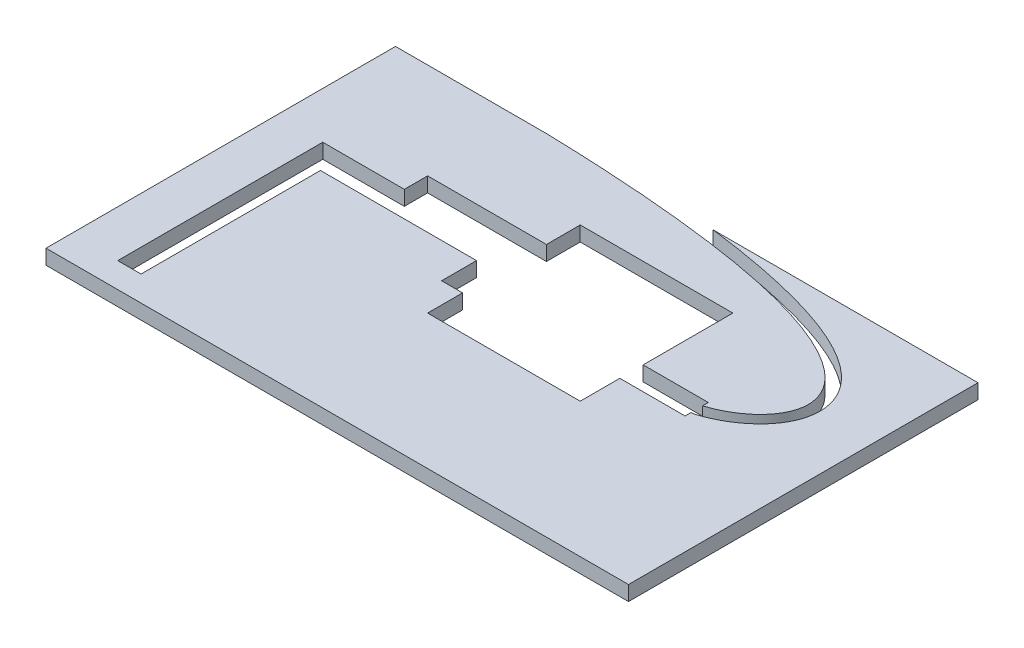
ISO-10303-21;
HEADER;
FILE_DESCRIPTION(('STEP AP214'),'2;1');
FILE_NAME('part.step','',(''),(''),'','','');
FILE_SCHEMA(('AUTOMOTIVE_DESIGN { 1 0 10303 214 1 1 1 1 }'));
ENDSEC;
DATA;
#1=APPLICATION_CONTEXT('core data for automotive mechanical design processes');
#2=APPLICATION_PROTOCOL_DEFINITION('international standard','automotive_design',2000,#1);
#3=PRODUCT_CONTEXT('',#1,'mechanical');
#4=PRODUCT('Part','Part','',(#3));
#5=PRODUCT_RELATED_PRODUCT_CATEGORY('part','',(#4));
#6=PRODUCT_DEFINITION_FORMATION('','',#4);
#7=PRODUCT_DEFINITION_CONTEXT('part definition',#1,'design');
#8=PRODUCT_DEFINITION('design','',#6,#7);
#9=PRODUCT_DEFINITION_SHAPE('','',#8);
#10=(LENGTH_UNIT() NAMED_UNIT(*) SI_UNIT(.MILLI.,.METRE.));
#11=(NAMED_UNIT(*) PLANE_ANGLE_UNIT() SI_UNIT($,.RADIAN.));
#12=(NAMED_UNIT(*) SI_UNIT($,.STERADIAN.) SOLID_ANGLE_UNIT());
#13=UNCERTAINTY_MEASURE_WITH_UNIT(LENGTH_MEASURE(1.E-05),#10,'distance_accuracy_value','');
#14=(GEOMETRIC_REPRESENTATION_CONTEXT(3) GLOBAL_UNCERTAINTY_ASSIGNED_CONTEXT((#13)) GLOBAL_UNIT_ASSIGNED_CONTEXT((#10,
#11,#12)) REPRESENTATION_CONTEXT('',''));
#15=CARTESIAN_POINT('',(0.,0.,0.));
#16=DIRECTION('',(0.,0.,1.));
#17=DIRECTION('',(1.,0.,0.));
#18=AXIS2_PLACEMENT_3D('',#15,#16,#17);
#19=CARTESIAN_POINT('',(11.34053228974,6.35,-75.));
#20=DIRECTION('',(0.,0.,1.));
#21=DIRECTION('',(1.,0.,0.));
#22=AXIS2_PLACEMENT_3D('',#19,#20,#21);
#23=PLANE('',#22);
#24=DIRECTION('',(-1.,0.,0.));
#25=VECTOR('',#24,1.);
#26=CARTESIAN_POINT('',(11.34053228974,0.,-75.));
#27=LINE('',#26,#25);
#28=CARTESIAN_POINT('',(125.,0.,-75.));
#29=VERTEX_POINT('',#28);
#30=CARTESIAN_POINT('',(11.3405326056849,0.,-75.0000024767574));
#31=VERTEX_POINT('',#30);
#32=EDGE_CURVE('E242',#29,#31,#27,.T.);
#33=ORIENTED_EDGE('',*,*,#32,.T.);
#34=DIRECTION('',(0.,-1.,0.));
#35=VECTOR('',#34,1.);
#36=CARTESIAN_POINT('',(11.3405326056849,6.35,-75.0000024767574));
#37=LINE('',#36,#35);
#38=CARTESIAN_POINT('',(11.3405326056849,6.35,-75.0000024767574));
#39=VERTEX_POINT('',#38);
#40=EDGE_CURVE('E11',#39,#31,#37,.T.);
#41=ORIENTED_EDGE('',*,*,#40,.F.);
#42=DIRECTION('',(-1.,0.,0.));
#43=VECTOR('',#42,1.);
#44=CARTESIAN_POINT('',(11.34053228974,6.35,-75.));
#45=LINE('',#44,#43);
#46=CARTESIAN_POINT('',(125.,6.35,-75.));
#47=VERTEX_POINT('',#46);
#48=EDGE_CURVE('E304',#47,#39,#45,.T.);
#49=ORIENTED_EDGE('',*,*,#48,.F.);
#50=DIRECTION('',(0.,-1.,0.));
#51=VECTOR('',#50,1.);
#52=CARTESIAN_POINT('',(125.,6.35,-75.));
#53=LINE('',#52,#51);
#54=EDGE_CURVE('E238',#47,#29,#53,.T.);
#55=ORIENTED_EDGE('',*,*,#54,.T.);
#56=EDGE_LOOP('',(#33,#41,#49,#55));
#57=FACE_BOUND('',#56,.T.);
#58=ADVANCED_FACE('F32',(#57),#23,.F.);
#59=CARTESIAN_POINT('',(-59.8676180191488,6.35,-79.9982471938817));
#60=CARTESIAN_POINT('',(-58.3701365612628,6.35,-79.9585853776501));
#61=CARTESIAN_POINT('',(-55.3563358386975,6.35,-79.8722181448976));
#62=CARTESIAN_POINT('',(-49.4815909142166,6.35,-79.6777111699217));
#63=CARTESIAN_POINT('',(-42.317738026553,6.35,-79.3915891409619));
#64=CARTESIAN_POINT('',(-34.0365193755814,6.35,-78.98234302079));
#65=CARTESIAN_POINT('',(-23.3969951315726,6.35,-78.3511650278801));
#66=CARTESIAN_POINT('',(-10.8443758688556,6.35,-77.4069664924747));
#67=CARTESIAN_POINT('',(3.06599334303034,6.35,-76.0412777275979));
#68=CARTESIAN_POINT('',(15.8637727031265,6.35,-74.4584722510144));
#69=CARTESIAN_POINT('',(31.4988229265428,6.35,-72.0787544208223));
#70=CARTESIAN_POINT('',(48.4668754676069,6.35,-68.6363462683328));
#71=CARTESIAN_POINT('',(65.0428990103915,6.35,-63.8669275282695));
#72=CARTESIAN_POINT('',(78.1767321943279,6.35,-58.5488488699207));
#73=CARTESIAN_POINT('',(88.2140590688272,6.35,-52.733240312104));
#74=CARTESIAN_POINT('',(95.4704601424928,6.35,-46.4059976378602));
#75=CARTESIAN_POINT('',(100.125264277799,6.35,-39.4914289547468));
#76=CARTESIAN_POINT('',(102.069690208737,6.35,-32.1108697625363));
#77=CARTESIAN_POINT('',(101.313529062244,6.35,-24.9425506592067));
#78=CARTESIAN_POINT('',(98.4533256841167,6.35,-18.5915794822402));
#79=CARTESIAN_POINT('',(94.1279275243369,6.35,-13.1582873344004));
#80=CARTESIAN_POINT('',(86.9558741819707,6.35,-7.10408049523904));
#81=CARTESIAN_POINT('',(80.4789458091353,6.35,-3.91902752008362));
#82=CARTESIAN_POINT('',(75.9958119832402,6.35,-2.51347108384346));
#83=B_SPLINE_CURVE_WITH_KNOTS('',3,(#59,#60,#61,#62,#63,#64,#65,#66,#67,#68,#69,#70,#71,#72,#73,
#74,#75,#76,#77,#78,#79,#80,#81,#82),.UNSPECIFIED.,.F.,.F.,(4,1,1,1,1,1,1,1,1,1,1,1,1,1,1,1,1,1,
1,1,1,4),(0.,0.0078125,0.015625,0.03125,0.046875,0.0625,0.09375,0.125,0.15625,0.1875,0.25,
0.3125,0.375,0.4375,0.5,0.5625,0.625,0.6875,0.75,0.8125,0.875,1.),.UNSPECIFIED.);
#84=DIRECTION('',(0.,-1.,0.));
#85=VECTOR('',#84,1.);
#86=SURFACE_OF_LINEAR_EXTRUSION('',#83,#85);
#87=CARTESIAN_POINT('',(-59.8676180191488,0.,-79.9982471938817));
#88=CARTESIAN_POINT('',(-58.3701365612628,0.,-79.9585853776501));
#89=CARTESIAN_POINT('',(-55.3563358386975,0.,-79.8722181448976));
#90=CARTESIAN_POINT('',(-49.4815909142166,0.,-79.6777111699217));
#91=CARTESIAN_POINT('',(-42.317738026553,0.,-79.3915891409619));
#92=CARTESIAN_POINT('',(-34.0365193755814,0.,-78.98234302079));
#93=CARTESIAN_POINT('',(-23.3969951315726,0.,-78.3511650278801));
#94=CARTESIAN_POINT('',(-10.8443758688556,0.,-77.4069664924747));
#95=CARTESIAN_POINT('',(3.06599334303034,0.,-76.0412777275979));
#96=CARTESIAN_POINT('',(15.8637727031265,0.,-74.4584722510144));
#97=CARTESIAN_POINT('',(31.4988229265428,0.,-72.0787544208223));
#98=CARTESIAN_POINT('',(48.4668754676069,0.,-68.6363462683328));
#99=CARTESIAN_POINT('',(65.0428990103915,0.,-63.8669275282695));
#100=CARTESIAN_POINT('',(78.1767321943279,0.,-58.5488488699207));
#101=CARTESIAN_POINT('',(88.2140590688272,0.,-52.733240312104));
#102=CARTESIAN_POINT('',(95.4704601424928,0.,-46.4059976378602));
#103=CARTESIAN_POINT('',(100.125264277799,0.,-39.4914289547468));
#104=CARTESIAN_POINT('',(102.069690208737,0.,-32.1108697625363));
#105=CARTESIAN_POINT('',(101.313529062244,0.,-24.9425506592067));
#106=CARTESIAN_POINT('',(98.4533256841167,0.,-18.5915794822402));
#107=CARTESIAN_POINT('',(94.1279275243369,0.,-13.1582873344004));
#108=CARTESIAN_POINT('',(86.9558741819707,0.,-7.10408049523904));
#109=CARTESIAN_POINT('',(80.4789458091353,0.,-3.91902752008362));
#110=CARTESIAN_POINT('',(75.9958119832402,0.,-2.51347108384346));
#111=B_SPLINE_CURVE_WITH_KNOTS('',3,(#87,#88,#89,#90,#91,#92,#93,#94,#95,#96,#97,#98,#99,#100,
#101,#102,#103,#104,#105,#106,#107,#108,#109,#110),.UNSPECIFIED.,.F.,.F.,(4,1,1,1,1,1,1,1,1,1,1,
1,1,1,1,1,1,1,1,1,1,4),(0.,0.0078125,0.015625,0.03125,0.046875,0.0625,0.09375,0.125,0.15625,
0.1875,0.25,0.3125,0.375,0.4375,0.5,0.5625,0.625,0.6875,0.75,0.8125,0.875,1.),.UNSPECIFIED.);
#112=CARTESIAN_POINT('',(75.9958119832402,0.,-2.51347108384346));
#113=VERTEX_POINT('',#112);
#114=EDGE_CURVE('E245',#31,#113,#111,.T.);
#115=ORIENTED_EDGE('',*,*,#114,.T.);
#116=DIRECTION('',(0.,-1.,0.));
#117=VECTOR('',#116,1.);
#118=CARTESIAN_POINT('',(75.9958119832402,6.35,-2.51347108384346));
#119=LINE('',#118,#117);
#120=CARTESIAN_POINT('',(75.9958119832402,6.35,-2.51347108384346));
#121=VERTEX_POINT('',#120);
#122=EDGE_CURVE('E40',#121,#113,#119,.T.);
#123=ORIENTED_EDGE('',*,*,#122,.F.);
#124=EDGE_CURVE('E148',#39,#121,#83,.T.);
#125=ORIENTED_EDGE('',*,*,#124,.F.);
#126=ORIENTED_EDGE('',*,*,#40,.T.);
#127=EDGE_LOOP('',(#115,#123,#125,#126));
#128=FACE_BOUND('',#127,.T.);
#129=ADVANCED_FACE('F520',(#128),#86,.F.);
#130=CARTESIAN_POINT('',(74.5,6.35,-2.28448214134428));
#131=DIRECTION('',(0.151323805959003,0.,0.988484246586703));
#132=DIRECTION('',(0.988484246586703,0.,-0.151323805959003));
#133=AXIS2_PLACEMENT_3D('',#130,#131,#132);
#134=PLANE('',#133);
#135=DIRECTION('',(-0.988484246586703,0.,0.151323805959003));
#136=VECTOR('',#135,1.);
#137=CARTESIAN_POINT('',(74.5,0.,-2.28448214134428));
#138=LINE('',#137,#136);
#139=CARTESIAN_POINT('',(74.5,0.,-2.28448214134428));
#140=VERTEX_POINT('',#139);
#141=EDGE_CURVE('E249',#113,#140,#138,.T.);
#142=ORIENTED_EDGE('',*,*,#141,.T.);
#143=DIRECTION('',(0.,-1.,0.));
#144=VECTOR('',#143,1.);
#145=CARTESIAN_POINT('',(74.5,6.35,-2.28448214134428));
#146=LINE('',#145,#144);
#147=CARTESIAN_POINT('',(74.5,6.35,-2.28448214134428));
#148=VERTEX_POINT('',#147);
#149=EDGE_CURVE('E368',#148,#140,#146,.T.);
#150=ORIENTED_EDGE('',*,*,#149,.F.);
#151=DIRECTION('',(-0.988484246586703,0.,0.151323805959003));
#152=VECTOR('',#151,1.);
#153=CARTESIAN_POINT('',(74.5,6.35,-2.28448214134428));
#154=LINE('',#153,#152);
#155=EDGE_CURVE('E376',#121,#148,#154,.T.);
#156=ORIENTED_EDGE('',*,*,#155,.F.);
#157=ORIENTED_EDGE('',*,*,#122,.T.);
#158=EDGE_LOOP('',(#142,#150,#156,#157));
#159=FACE_BOUND('',#158,.T.);
#160=ADVANCED_FACE('F374',(#159),#134,.F.);
#161=CARTESIAN_POINT('',(74.5,6.35,0.215517858655716));
#162=DIRECTION('',(1.,0.,0.));
#163=DIRECTION('',(0.,0.,-1.));
#164=AXIS2_PLACEMENT_3D('',#161,#162,#163);
#165=PLANE('',#164);
#166=DIRECTION('',(0.,0.,1.));
#167=VECTOR('',#166,1.);
#168=CARTESIAN_POINT('',(74.5,0.,0.215517858655716));
#169=LINE('',#168,#167);
#170=CARTESIAN_POINT('',(74.5,0.,0.215517858655716));
#171=VERTEX_POINT('',#170);
#172=EDGE_CURVE('E254',#140,#171,#169,.T.);
#173=ORIENTED_EDGE('',*,*,#172,.T.);
#174=DIRECTION('',(0.,-1.,0.));
#175=VECTOR('',#174,1.);
#176=CARTESIAN_POINT('',(74.5,6.35,0.215517858655716));
#177=LINE('',#176,#175);
#178=CARTESIAN_POINT('',(74.5,6.35,0.215517858655716));
#179=VERTEX_POINT('',#178);
#180=EDGE_CURVE('E365',#179,#171,#177,.T.);
#181=ORIENTED_EDGE('',*,*,#180,.F.);
#182=DIRECTION('',(0.,0.,1.));
#183=VECTOR('',#182,1.);
#184=CARTESIAN_POINT('',(74.5,6.35,0.215517858655716));
#185=LINE('',#184,#183);
#186=EDGE_CURVE('E394',#148,#179,#185,.T.);
#187=ORIENTED_EDGE('',*,*,#186,.F.);
#188=ORIENTED_EDGE('',*,*,#149,.T.);
#189=EDGE_LOOP('',(#173,#181,#187,#188));
#190=FACE_BOUND('',#189,.T.);
#191=ADVANCED_FACE('F385',(#190),#165,.F.);
#192=CARTESIAN_POINT('',(46.5,6.35,0.215517858655716));
#193=DIRECTION('',(0.,0.,1.));
#194=DIRECTION('',(1.,0.,0.));
#195=AXIS2_PLACEMENT_3D('',#192,#193,#194);
#196=PLANE('',#195);
#197=DIRECTION('',(-1.,0.,0.));
#198=VECTOR('',#197,1.);
#199=CARTESIAN_POINT('',(46.5,0.,0.215517858655716));
#200=LINE('',#199,#198);
#201=CARTESIAN_POINT('',(46.5,0.,0.215517858655716));
#202=VERTEX_POINT('',#201);
#203=EDGE_CURVE('E256',#171,#202,#200,.T.);
#204=ORIENTED_EDGE('',*,*,#203,.T.);
#205=DIRECTION('',(0.,-1.,0.));
#206=VECTOR('',#205,1.);
#207=CARTESIAN_POINT('',(46.5,6.35,0.215517858655716));
#208=LINE('',#207,#206);
#209=CARTESIAN_POINT('',(46.5,6.35,0.215517858655716));
#210=VERTEX_POINT('',#209);
#211=EDGE_CURVE('E362',#210,#202,#208,.T.);
#212=ORIENTED_EDGE('',*,*,#211,.F.);
#213=DIRECTION('',(-1.,0.,0.));
#214=VECTOR('',#213,1.);
#215=CARTESIAN_POINT('',(46.5,6.35,0.215517858655716));
#216=LINE('',#215,#214);
#217=EDGE_CURVE('E391',#179,#210,#216,.T.);
#218=ORIENTED_EDGE('',*,*,#217,.F.);
#219=ORIENTED_EDGE('',*,*,#180,.T.);
#220=EDGE_LOOP('',(#204,#212,#218,#219));
#221=FACE_BOUND('',#220,.T.);
#222=ADVANCED_FACE('F389',(#221),#196,.F.);
#223=CARTESIAN_POINT('',(46.5,6.35,17.2155178586557));
#224=DIRECTION('',(1.,0.,0.));
#225=DIRECTION('',(0.,0.,-1.));
#226=AXIS2_PLACEMENT_3D('',#223,#224,#225);
#227=PLANE('',#226);
#228=DIRECTION('',(0.,0.,1.));
#229=VECTOR('',#228,1.);
#230=CARTESIAN_POINT('',(46.5,0.,17.2155178586557));
#231=LINE('',#230,#229);
#232=CARTESIAN_POINT('',(46.5,0.,17.2155178586557));
#233=VERTEX_POINT('',#232);
#234=EDGE_CURVE('E258',#202,#233,#231,.T.);
#235=ORIENTED_EDGE('',*,*,#234,.T.);
#236=DIRECTION('',(0.,-1.,0.));
#237=VECTOR('',#236,1.);
#238=CARTESIAN_POINT('',(46.5,6.35,17.2155178586557));
#239=LINE('',#238,#237);
#240=CARTESIAN_POINT('',(46.5,6.35,17.2155178586557));
#241=VERTEX_POINT('',#240);
#242=EDGE_CURVE('E359',#241,#233,#239,.T.);
#243=ORIENTED_EDGE('',*,*,#242,.F.);
#244=DIRECTION('',(0.,0.,1.));
#245=VECTOR('',#244,1.);
#246=CARTESIAN_POINT('',(46.5,6.35,17.2155178586557));
#247=LINE('',#246,#245);
#248=EDGE_CURVE('E393',#210,#241,#247,.T.);
#249=ORIENTED_EDGE('',*,*,#248,.F.);
#250=ORIENTED_EDGE('',*,*,#211,.T.);
#251=EDGE_LOOP('',(#235,#243,#249,#250));
#252=FACE_BOUND('',#251,.T.);
#253=ADVANCED_FACE('F510',(#252),#227,.F.);
#254=CARTESIAN_POINT('',(-19.,6.35,17.2155178586557));
#255=DIRECTION('',(0.,0.,1.));
#256=DIRECTION('',(1.,0.,0.));
#257=AXIS2_PLACEMENT_3D('',#254,#255,#256);
#258=PLANE('',#257);
#259=DIRECTION('',(-1.,0.,0.));
#260=VECTOR('',#259,1.);
#261=CARTESIAN_POINT('',(-19.,0.,17.2155178586557));
#262=LINE('',#261,#260);
#263=CARTESIAN_POINT('',(-19.,0.,17.2155178586557));
#264=VERTEX_POINT('',#263);
#265=EDGE_CURVE('E260',#233,#264,#262,.T.);
#266=ORIENTED_EDGE('',*,*,#265,.T.);
#267=DIRECTION('',(0.,-1.,0.));
#268=VECTOR('',#267,1.);
#269=CARTESIAN_POINT('',(-19.,6.35,17.2155178586557));
#270=LINE('',#269,#268);
#271=CARTESIAN_POINT('',(-19.,6.35,17.2155178586557));
#272=VERTEX_POINT('',#271);
#273=EDGE_CURVE('E356',#272,#264,#270,.T.);
#274=ORIENTED_EDGE('',*,*,#273,.F.);
#275=DIRECTION('',(-1.,0.,0.));
#276=VECTOR('',#275,1.);
#277=CARTESIAN_POINT('',(-19.,6.35,17.2155178586557));
#278=LINE('',#277,#276);
#279=EDGE_CURVE('E396',#241,#272,#278,.T.);
#280=ORIENTED_EDGE('',*,*,#279,.F.);
#281=ORIENTED_EDGE('',*,*,#242,.T.);
#282=EDGE_LOOP('',(#266,#274,#280,#281));
#283=FACE_BOUND('',#282,.T.);
#284=ADVANCED_FACE('F506',(#283),#258,.F.);
#285=CARTESIAN_POINT('',(-19.,6.35,2.21551785865572));
#286=DIRECTION('',(-1.,0.,0.));
#287=DIRECTION('',(0.,0.,1.));
#288=AXIS2_PLACEMENT_3D('',#285,#286,#287);
#289=PLANE('',#288);
#290=DIRECTION('',(0.,0.,-1.));
#291=VECTOR('',#290,1.);
#292=CARTESIAN_POINT('',(-19.,0.,2.21551785865572));
#293=LINE('',#292,#291);
#294=CARTESIAN_POINT('',(-19.,0.,2.21551785865572));
#295=VERTEX_POINT('',#294);
#296=EDGE_CURVE('E262',#264,#295,#293,.T.);
#297=ORIENTED_EDGE('',*,*,#296,.T.);
#298=DIRECTION('',(0.,-1.,0.));
#299=VECTOR('',#298,1.);
#300=CARTESIAN_POINT('',(-19.,6.35,2.21551785865572));
#301=LINE('',#300,#299);
#302=CARTESIAN_POINT('',(-19.,6.35,2.21551785865572));
#303=VERTEX_POINT('',#302);
#304=EDGE_CURVE('E353',#303,#295,#301,.T.);
#305=ORIENTED_EDGE('',*,*,#304,.F.);
#306=DIRECTION('',(0.,0.,-1.));
#307=VECTOR('',#306,1.);
#308=CARTESIAN_POINT('',(-19.,6.35,2.21551785865572));
#309=LINE('',#308,#307);
#310=EDGE_CURVE('E402',#272,#303,#309,.T.);
#311=ORIENTED_EDGE('',*,*,#310,.F.);
#312=ORIENTED_EDGE('',*,*,#273,.T.);
#313=EDGE_LOOP('',(#297,#305,#311,#312));
#314=FACE_BOUND('',#313,.T.);
#315=ADVANCED_FACE('F502',(#314),#289,.F.);
#316=CARTESIAN_POINT('',(-28.,6.35,2.21551785865572));
#317=DIRECTION('',(0.,0.,1.));
#318=DIRECTION('',(1.,0.,0.));
#319=AXIS2_PLACEMENT_3D('',#316,#317,#318);
#320=PLANE('',#319);
#321=DIRECTION('',(-1.,0.,0.));
#322=VECTOR('',#321,1.);
#323=CARTESIAN_POINT('',(-28.,0.,2.21551785865572));
#324=LINE('',#323,#322);
#325=CARTESIAN_POINT('',(-28.,0.,2.21551785865572));
#326=VERTEX_POINT('',#325);
#327=EDGE_CURVE('E264',#295,#326,#324,.T.);
#328=ORIENTED_EDGE('',*,*,#327,.T.);
#329=DIRECTION('',(0.,-1.,0.));
#330=VECTOR('',#329,1.);
#331=CARTESIAN_POINT('',(-28.,6.35,2.21551785865572));
#332=LINE('',#331,#330);
#333=CARTESIAN_POINT('',(-28.,6.35,2.21551785865572));
#334=VERTEX_POINT('',#333);
#335=EDGE_CURVE('E350',#334,#326,#332,.T.);
#336=ORIENTED_EDGE('',*,*,#335,.F.);
#337=DIRECTION('',(-1.,0.,0.));
#338=VECTOR('',#337,1.);
#339=CARTESIAN_POINT('',(-28.,6.35,2.21551785865572));
#340=LINE('',#339,#338);
#341=EDGE_CURVE('E404',#303,#334,#340,.T.);
#342=ORIENTED_EDGE('',*,*,#341,.F.);
#343=ORIENTED_EDGE('',*,*,#304,.T.);
#344=EDGE_LOOP('',(#328,#336,#342,#343));
#345=FACE_BOUND('',#344,.T.);
#346=ADVANCED_FACE('F498',(#345),#320,.F.);
#347=CARTESIAN_POINT('',(-28.,6.35,-12.7844821413443));
#348=DIRECTION('',(-1.,0.,0.));
#349=DIRECTION('',(0.,0.,1.));
#350=AXIS2_PLACEMENT_3D('',#347,#348,#349);
#351=PLANE('',#350);
#352=DIRECTION('',(0.,0.,-1.));
#353=VECTOR('',#352,1.);
#354=CARTESIAN_POINT('',(-28.,0.,-12.7844821413443));
#355=LINE('',#354,#353);
#356=CARTESIAN_POINT('',(-28.,0.,-12.7844821413443));
#357=VERTEX_POINT('',#356);
#358=EDGE_CURVE('E266',#326,#357,#355,.T.);
#359=ORIENTED_EDGE('',*,*,#358,.T.);
#360=DIRECTION('',(0.,-1.,0.));
#361=VECTOR('',#360,1.);
#362=CARTESIAN_POINT('',(-28.,6.35,-12.7844821413443));
#363=LINE('',#362,#361);
#364=CARTESIAN_POINT('',(-28.,6.35,-12.7844821413443));
#365=VERTEX_POINT('',#364);
#366=EDGE_CURVE('E347',#365,#357,#363,.T.);
#367=ORIENTED_EDGE('',*,*,#366,.F.);
#368=DIRECTION('',(0.,0.,-1.));
#369=VECTOR('',#368,1.);
#370=CARTESIAN_POINT('',(-28.,6.35,-12.7844821413443));
#371=LINE('',#370,#369);
#372=EDGE_CURVE('E406',#334,#365,#371,.T.);
#373=ORIENTED_EDGE('',*,*,#372,.F.);
#374=ORIENTED_EDGE('',*,*,#335,.T.);
#375=EDGE_LOOP('',(#359,#367,#373,#374));
#376=FACE_BOUND('',#375,.T.);
#377=ADVANCED_FACE('F494',(#376),#351,.F.);
#378=CARTESIAN_POINT('',(-95.,6.35,-12.7844821413443));
#379=DIRECTION('',(0.,0.,1.));
#380=DIRECTION('',(1.,0.,0.));
#381=AXIS2_PLACEMENT_3D('',#378,#379,#380);
#382=PLANE('',#381);
#383=DIRECTION('',(-1.,0.,0.));
#384=VECTOR('',#383,1.);
#385=CARTESIAN_POINT('',(-95.,0.,-12.7844821413443));
#386=LINE('',#385,#384);
#387=CARTESIAN_POINT('',(-95.,0.,-12.7844821413443));
#388=VERTEX_POINT('',#387);
#389=EDGE_CURVE('E268',#357,#388,#386,.T.);
#390=ORIENTED_EDGE('',*,*,#389,.T.);
#391=DIRECTION('',(0.,-1.,0.));
#392=VECTOR('',#391,1.);
#393=CARTESIAN_POINT('',(-95.,6.35,-12.7844821413443));
#394=LINE('',#393,#392);
#395=CARTESIAN_POINT('',(-95.,6.35,-12.7844821413443));
#396=VERTEX_POINT('',#395);
#397=EDGE_CURVE('E344',#396,#388,#394,.T.);
#398=ORIENTED_EDGE('',*,*,#397,.F.);
#399=DIRECTION('',(-1.,0.,0.));
#400=VECTOR('',#399,1.);
#401=CARTESIAN_POINT('',(-95.,6.35,-12.7844821413443));
#402=LINE('',#401,#400);
#403=EDGE_CURVE('E408',#365,#396,#402,.T.);
#404=ORIENTED_EDGE('',*,*,#403,.F.);
#405=ORIENTED_EDGE('',*,*,#366,.T.);
#406=EDGE_LOOP('',(#390,#398,#404,#405));
#407=FACE_BOUND('',#406,.T.);
#408=ADVANCED_FACE('F490',(#407),#382,.F.);
#409=CARTESIAN_POINT('',(-95.,6.35,64.2155178586557));
#410=DIRECTION('',(1.,0.,0.));
#411=DIRECTION('',(0.,0.,-1.));
#412=AXIS2_PLACEMENT_3D('',#409,#410,#411);
#413=PLANE('',#412);
#414=DIRECTION('',(0.,0.,1.));
#415=VECTOR('',#414,1.);
#416=CARTESIAN_POINT('',(-95.,0.,64.2155178586557));
#417=LINE('',#416,#415);
#418=CARTESIAN_POINT('',(-95.,0.,64.2155178586557));
#419=VERTEX_POINT('',#418);
#420=EDGE_CURVE('E270',#388,#419,#417,.T.);
#421=ORIENTED_EDGE('',*,*,#420,.T.);
#422=DIRECTION('',(0.,-1.,0.));
#423=VECTOR('',#422,1.);
#424=CARTESIAN_POINT('',(-95.,6.35,64.2155178586557));
#425=LINE('',#424,#423);
#426=CARTESIAN_POINT('',(-95.,6.35,64.2155178586557));
#427=VERTEX_POINT('',#426);
#428=EDGE_CURVE('E341',#427,#419,#425,.T.);
#429=ORIENTED_EDGE('',*,*,#428,.F.);
#430=DIRECTION('',(0.,0.,1.));
#431=VECTOR('',#430,1.);
#432=CARTESIAN_POINT('',(-95.,6.35,64.2155178586557));
#433=LINE('',#432,#431);
#434=EDGE_CURVE('E410',#396,#427,#433,.T.);
#435=ORIENTED_EDGE('',*,*,#434,.F.);
#436=ORIENTED_EDGE('',*,*,#397,.T.);
#437=EDGE_LOOP('',(#421,#429,#435,#436));
#438=FACE_BOUND('',#437,.T.);
#439=ADVANCED_FACE('F486',(#438),#413,.F.);
#440=CARTESIAN_POINT('',(-105.,6.35,64.2155178586557));
#441=DIRECTION('',(0.,0.,1.));
#442=DIRECTION('',(1.,0.,0.));
#443=AXIS2_PLACEMENT_3D('',#440,#441,#442);
#444=PLANE('',#443);
#445=DIRECTION('',(-1.,0.,0.));
#446=VECTOR('',#445,1.);
#447=CARTESIAN_POINT('',(-105.,0.,64.2155178586557));
#448=LINE('',#447,#446);
#449=CARTESIAN_POINT('',(-105.,0.,64.2155178586557));
#450=VERTEX_POINT('',#449);
#451=EDGE_CURVE('E272',#419,#450,#448,.T.);
#452=ORIENTED_EDGE('',*,*,#451,.T.);
#453=DIRECTION('',(0.,-1.,0.));
#454=VECTOR('',#453,1.);
#455=CARTESIAN_POINT('',(-105.,6.35,64.2155178586557));
#456=LINE('',#455,#454);
#457=CARTESIAN_POINT('',(-105.,6.35,64.2155178586557));
#458=VERTEX_POINT('',#457);
#459=EDGE_CURVE('E338',#458,#450,#456,.T.);
#460=ORIENTED_EDGE('',*,*,#459,.F.);
#461=DIRECTION('',(-1.,0.,0.));
#462=VECTOR('',#461,1.);
#463=CARTESIAN_POINT('',(-105.,6.35,64.2155178586557));
#464=LINE('',#463,#462);
#465=EDGE_CURVE('E412',#427,#458,#464,.T.);
#466=ORIENTED_EDGE('',*,*,#465,.F.);
#467=ORIENTED_EDGE('',*,*,#428,.T.);
#468=EDGE_LOOP('',(#452,#460,#466,#467));
#469=FACE_BOUND('',#468,.T.);
#470=ADVANCED_FACE('F482',(#469),#444,.F.);
#471=CARTESIAN_POINT('',(-105.,6.35,-23.7844821413443));
#472=DIRECTION('',(-1.,0.,0.));
#473=DIRECTION('',(0.,0.,1.));
#474=AXIS2_PLACEMENT_3D('',#471,#472,#473);
#475=PLANE('',#474);
#476=DIRECTION('',(0.,0.,-1.));
#477=VECTOR('',#476,1.);
#478=CARTESIAN_POINT('',(-105.,0.,-23.7844821413443));
#479=LINE('',#478,#477);
#480=CARTESIAN_POINT('',(-105.,0.,-23.7844821413443));
#481=VERTEX_POINT('',#480);
#482=EDGE_CURVE('E274',#450,#481,#479,.T.);
#483=ORIENTED_EDGE('',*,*,#482,.T.);
#484=DIRECTION('',(0.,-1.,0.));
#485=VECTOR('',#484,1.);
#486=CARTESIAN_POINT('',(-105.,6.35,-23.7844821413443));
#487=LINE('',#486,#485);
#488=CARTESIAN_POINT('',(-105.,6.35,-23.7844821413443));
#489=VERTEX_POINT('',#488);
#490=EDGE_CURVE('E335',#489,#481,#487,.T.);
#491=ORIENTED_EDGE('',*,*,#490,.F.);
#492=DIRECTION('',(0.,0.,-1.));
#493=VECTOR('',#492,1.);
#494=CARTESIAN_POINT('',(-105.,6.35,-23.7844821413443));
#495=LINE('',#494,#493);
#496=EDGE_CURVE('E414',#458,#489,#495,.T.);
#497=ORIENTED_EDGE('',*,*,#496,.F.);
#498=ORIENTED_EDGE('',*,*,#459,.T.);
#499=EDGE_LOOP('',(#483,#491,#497,#498));
#500=FACE_BOUND('',#499,.T.);
#501=ADVANCED_FACE('F478',(#500),#475,.F.);
#502=CARTESIAN_POINT('',(-70.,6.35,-23.7844821413443));
#503=DIRECTION('',(0.,0.,-1.));
#504=DIRECTION('',(-1.,0.,0.));
#505=AXIS2_PLACEMENT_3D('',#502,#503,#504);
#506=PLANE('',#505);
#507=DIRECTION('',(1.,0.,0.));
#508=VECTOR('',#507,1.);
#509=CARTESIAN_POINT('',(-70.,0.,-23.7844821413443));
#510=LINE('',#509,#508);
#511=CARTESIAN_POINT('',(-70.,0.,-23.7844821413443));
#512=VERTEX_POINT('',#511);
#513=EDGE_CURVE('E276',#481,#512,#510,.T.);
#514=ORIENTED_EDGE('',*,*,#513,.T.);
#515=DIRECTION('',(0.,-1.,0.));
#516=VECTOR('',#515,1.);
#517=CARTESIAN_POINT('',(-70.,6.35,-23.7844821413443));
#518=LINE('',#517,#516);
#519=CARTESIAN_POINT('',(-70.,6.35,-23.7844821413443));
#520=VERTEX_POINT('',#519);
#521=EDGE_CURVE('E332',#520,#512,#518,.T.);
#522=ORIENTED_EDGE('',*,*,#521,.F.);
#523=DIRECTION('',(1.,0.,0.));
#524=VECTOR('',#523,1.);
#525=CARTESIAN_POINT('',(-70.,6.35,-23.7844821413443));
#526=LINE('',#525,#524);
#527=EDGE_CURVE('E416',#489,#520,#526,.T.);
#528=ORIENTED_EDGE('',*,*,#527,.F.);
#529=ORIENTED_EDGE('',*,*,#490,.T.);
#530=EDGE_LOOP('',(#514,#522,#528,#529));
#531=FACE_BOUND('',#530,.T.);
#532=ADVANCED_FACE('F474',(#531),#506,.F.);
#533=CARTESIAN_POINT('',(-70.,6.35,-33.7844821413443));
#534=DIRECTION('',(-1.,0.,0.));
#535=DIRECTION('',(0.,0.,1.));
#536=AXIS2_PLACEMENT_3D('',#533,#534,#535);
#537=PLANE('',#536);
#538=DIRECTION('',(0.,0.,-1.));
#539=VECTOR('',#538,1.);
#540=CARTESIAN_POINT('',(-70.,0.,-33.7844821413443));
#541=LINE('',#540,#539);
#542=CARTESIAN_POINT('',(-70.,0.,-33.7844821413443));
#543=VERTEX_POINT('',#542);
#544=EDGE_CURVE('E278',#512,#543,#541,.T.);
#545=ORIENTED_EDGE('',*,*,#544,.T.);
#546=DIRECTION('',(0.,-1.,0.));
#547=VECTOR('',#546,1.);
#548=CARTESIAN_POINT('',(-70.,6.35,-33.7844821413443));
#549=LINE('',#548,#547);
#550=CARTESIAN_POINT('',(-70.,6.35,-33.7844821413443));
#551=VERTEX_POINT('',#550);
#552=EDGE_CURVE('E329',#551,#543,#549,.T.);
#553=ORIENTED_EDGE('',*,*,#552,.F.);
#554=DIRECTION('',(0.,0.,-1.));
#555=VECTOR('',#554,1.);
#556=CARTESIAN_POINT('',(-70.,6.35,-33.7844821413443));
#557=LINE('',#556,#555);
#558=EDGE_CURVE('E418',#520,#551,#557,.T.);
#559=ORIENTED_EDGE('',*,*,#558,.F.);
#560=ORIENTED_EDGE('',*,*,#521,.T.);
#561=EDGE_LOOP('',(#545,#553,#559,#560));
#562=FACE_BOUND('',#561,.T.);
#563=ADVANCED_FACE('F470',(#562),#537,.F.);
#564=CARTESIAN_POINT('',(-19.,6.35,-33.7844821413443));
#565=DIRECTION('',(0.,0.,-1.));
#566=DIRECTION('',(-1.,0.,0.));
#567=AXIS2_PLACEMENT_3D('',#564,#565,#566);
#568=PLANE('',#567);
#569=DIRECTION('',(1.,0.,0.));
#570=VECTOR('',#569,1.);
#571=CARTESIAN_POINT('',(-19.,0.,-33.7844821413443));
#572=LINE('',#571,#570);
#573=CARTESIAN_POINT('',(-19.,0.,-33.7844821413443));
#574=VERTEX_POINT('',#573);
#575=EDGE_CURVE('E280',#543,#574,#572,.T.);
#576=ORIENTED_EDGE('',*,*,#575,.T.);
#577=DIRECTION('',(0.,-1.,0.));
#578=VECTOR('',#577,1.);
#579=CARTESIAN_POINT('',(-19.,6.35,-33.7844821413443));
#580=LINE('',#579,#578);
#581=CARTESIAN_POINT('',(-19.,6.35,-33.7844821413443));
#582=VERTEX_POINT('',#581);
#583=EDGE_CURVE('E326',#582,#574,#580,.T.);
#584=ORIENTED_EDGE('',*,*,#583,.F.);
#585=DIRECTION('',(1.,0.,0.));
#586=VECTOR('',#585,1.);
#587=CARTESIAN_POINT('',(-19.,6.35,-33.7844821413443));
#588=LINE('',#587,#586);
#589=EDGE_CURVE('E420',#551,#582,#588,.T.);
#590=ORIENTED_EDGE('',*,*,#589,.F.);
#591=ORIENTED_EDGE('',*,*,#552,.T.);
#592=EDGE_LOOP('',(#576,#584,#590,#591));
#593=FACE_BOUND('',#592,.T.);
#594=ADVANCED_FACE('F466',(#593),#568,.F.);
#595=CARTESIAN_POINT('',(-19.,6.35,-48.2844821413443));
#596=DIRECTION('',(-1.,0.,0.));
#597=DIRECTION('',(0.,0.,1.));
#598=AXIS2_PLACEMENT_3D('',#595,#596,#597);
#599=PLANE('',#598);
#600=DIRECTION('',(0.,0.,-1.));
#601=VECTOR('',#600,1.);
#602=CARTESIAN_POINT('',(-19.,0.,-48.2844821413443));
#603=LINE('',#602,#601);
#604=CARTESIAN_POINT('',(-19.,0.,-48.2844821413443));
#605=VERTEX_POINT('',#604);
#606=EDGE_CURVE('E282',#574,#605,#603,.T.);
#607=ORIENTED_EDGE('',*,*,#606,.T.);
#608=DIRECTION('',(0.,-1.,0.));
#609=VECTOR('',#608,1.);
#610=CARTESIAN_POINT('',(-19.,6.35,-48.2844821413443));
#611=LINE('',#610,#609);
#612=CARTESIAN_POINT('',(-19.,6.35,-48.2844821413443));
#613=VERTEX_POINT('',#612);
#614=EDGE_CURVE('E323',#613,#605,#611,.T.);
#615=ORIENTED_EDGE('',*,*,#614,.F.);
#616=DIRECTION('',(0.,0.,-1.));
#617=VECTOR('',#616,1.);
#618=CARTESIAN_POINT('',(-19.,6.35,-48.2844821413443));
#619=LINE('',#618,#617);
#620=EDGE_CURVE('E422',#582,#613,#619,.T.);
#621=ORIENTED_EDGE('',*,*,#620,.F.);
#622=ORIENTED_EDGE('',*,*,#583,.T.);
#623=EDGE_LOOP('',(#607,#615,#621,#622));
#624=FACE_BOUND('',#623,.T.);
#625=ADVANCED_FACE('F462',(#624),#599,.F.);
#626=CARTESIAN_POINT('',(46.5,6.35,-48.2844821413443));
#627=DIRECTION('',(0.,0.,-1.));
#628=DIRECTION('',(-1.,0.,0.));
#629=AXIS2_PLACEMENT_3D('',#626,#627,#628);
#630=PLANE('',#629);
#631=DIRECTION('',(1.,0.,0.));
#632=VECTOR('',#631,1.);
#633=CARTESIAN_POINT('',(46.5,0.,-48.2844821413443));
#634=LINE('',#633,#632);
#635=CARTESIAN_POINT('',(46.5,0.,-48.2844821413443));
#636=VERTEX_POINT('',#635);
#637=EDGE_CURVE('E284',#605,#636,#634,.T.);
#638=ORIENTED_EDGE('',*,*,#637,.T.);
#639=DIRECTION('',(0.,-1.,0.));
#640=VECTOR('',#639,1.);
#641=CARTESIAN_POINT('',(46.5,6.35,-48.2844821413443));
#642=LINE('',#641,#640);
#643=CARTESIAN_POINT('',(46.5,6.35,-48.2844821413443));
#644=VERTEX_POINT('',#643);
#645=EDGE_CURVE('E320',#644,#636,#642,.T.);
#646=ORIENTED_EDGE('',*,*,#645,.F.);
#647=DIRECTION('',(1.,0.,0.));
#648=VECTOR('',#647,1.);
#649=CARTESIAN_POINT('',(46.5,6.35,-48.2844821413443));
#650=LINE('',#649,#648);
#651=EDGE_CURVE('E424',#613,#644,#650,.T.);
#652=ORIENTED_EDGE('',*,*,#651,.F.);
#653=ORIENTED_EDGE('',*,*,#614,.T.);
#654=EDGE_LOOP('',(#638,#646,#652,#653));
#655=FACE_BOUND('',#654,.T.);
#656=ADVANCED_FACE('F458',(#655),#630,.F.);
#657=CARTESIAN_POINT('',(46.5,6.35,-9.78448214134429));
#658=DIRECTION('',(1.,0.,0.));
#659=DIRECTION('',(0.,0.,-1.));
#660=AXIS2_PLACEMENT_3D('',#657,#658,#659);
#661=PLANE('',#660);
#662=DIRECTION('',(0.,0.,1.));
#663=VECTOR('',#662,1.);
#664=CARTESIAN_POINT('',(46.5,0.,-9.78448214134429));
#665=LINE('',#664,#663);
#666=CARTESIAN_POINT('',(46.5,0.,-9.78448214134429));
#667=VERTEX_POINT('',#666);
#668=EDGE_CURVE('E286',#636,#667,#665,.T.);
#669=ORIENTED_EDGE('',*,*,#668,.T.);
#670=DIRECTION('',(0.,-1.,0.));
#671=VECTOR('',#670,1.);
#672=CARTESIAN_POINT('',(46.5,6.35,-9.78448214134429));
#673=LINE('',#672,#671);
#674=CARTESIAN_POINT('',(46.5,6.35,-9.78448214134429));
#675=VERTEX_POINT('',#674);
#676=EDGE_CURVE('E317',#675,#667,#673,.T.);
#677=ORIENTED_EDGE('',*,*,#676,.F.);
#678=DIRECTION('',(0.,0.,1.));
#679=VECTOR('',#678,1.);
#680=CARTESIAN_POINT('',(46.5,6.35,-9.78448214134429));
#681=LINE('',#680,#679);
#682=EDGE_CURVE('E426',#644,#675,#681,.T.);
#683=ORIENTED_EDGE('',*,*,#682,.F.);
#684=ORIENTED_EDGE('',*,*,#645,.T.);
#685=EDGE_LOOP('',(#669,#677,#683,#684));
#686=FACE_BOUND('',#685,.T.);
#687=ADVANCED_FACE('F454',(#686),#661,.F.);
#688=CARTESIAN_POINT('',(74.5,6.35,-9.78448214134428));
#689=DIRECTION('',(0.,0.,-1.));
#690=DIRECTION('',(-1.,0.,0.));
#691=AXIS2_PLACEMENT_3D('',#688,#689,#690);
#692=PLANE('',#691);
#693=DIRECTION('',(1.,0.,0.));
#694=VECTOR('',#693,1.);
#695=CARTESIAN_POINT('',(74.5,0.,-9.78448214134428));
#696=LINE('',#695,#694);
#697=CARTESIAN_POINT('',(74.5,0.,-9.78448214134428));
#698=VERTEX_POINT('',#697);
#699=EDGE_CURVE('E288',#667,#698,#696,.T.);
#700=ORIENTED_EDGE('',*,*,#699,.T.);
#701=DIRECTION('',(0.,-1.,0.));
#702=VECTOR('',#701,1.);
#703=CARTESIAN_POINT('',(74.5,6.35,-9.78448214134428));
#704=LINE('',#703,#702);
#705=CARTESIAN_POINT('',(74.5,6.35,-9.78448214134428));
#706=VERTEX_POINT('',#705);
#707=EDGE_CURVE('E314',#706,#698,#704,.T.);
#708=ORIENTED_EDGE('',*,*,#707,.F.);
#709=DIRECTION('',(1.,0.,0.));
#710=VECTOR('',#709,1.);
#711=CARTESIAN_POINT('',(74.5,6.35,-9.78448214134428));
#712=LINE('',#711,#710);
#713=EDGE_CURVE('E428',#675,#706,#712,.T.);
#714=ORIENTED_EDGE('',*,*,#713,.F.);
#715=ORIENTED_EDGE('',*,*,#676,.T.);
#716=EDGE_LOOP('',(#700,#708,#714,#715));
#717=FACE_BOUND('',#716,.T.);
#718=ADVANCED_FACE('F450',(#717),#692,.F.);
#719=CARTESIAN_POINT('',(74.5,6.35,-7.28448214134429));
#720=DIRECTION('',(1.,0.,0.));
#721=DIRECTION('',(0.,0.,-1.));
#722=AXIS2_PLACEMENT_3D('',#719,#720,#721);
#723=PLANE('',#722);
#724=DIRECTION('',(0.,0.,1.));
#725=VECTOR('',#724,1.);
#726=CARTESIAN_POINT('',(74.5,0.,-7.28448214134429));
#727=LINE('',#726,#725);
#728=CARTESIAN_POINT('',(74.5,0.,-7.28448214134429));
#729=VERTEX_POINT('',#728);
#730=EDGE_CURVE('E290',#698,#729,#727,.T.);
#731=ORIENTED_EDGE('',*,*,#730,.T.);
#732=DIRECTION('',(0.,-1.,0.));
#733=VECTOR('',#732,1.);
#734=CARTESIAN_POINT('',(74.5,6.35,-7.28448214134429));
#735=LINE('',#734,#733);
#736=CARTESIAN_POINT('',(74.5,6.35,-7.28448214134429));
#737=VERTEX_POINT('',#736);
#738=EDGE_CURVE('E311',#737,#729,#735,.T.);
#739=ORIENTED_EDGE('',*,*,#738,.F.);
#740=DIRECTION('',(0.,0.,1.));
#741=VECTOR('',#740,1.);
#742=CARTESIAN_POINT('',(74.5,6.35,-7.28448214134429));
#743=LINE('',#742,#741);
#744=EDGE_CURVE('E430',#706,#737,#743,.T.);
#745=ORIENTED_EDGE('',*,*,#744,.F.);
#746=ORIENTED_EDGE('',*,*,#707,.T.);
#747=EDGE_LOOP('',(#731,#739,#745,#746));
#748=FACE_BOUND('',#747,.T.);
#749=ADVANCED_FACE('F445',(#748),#723,.F.);
#750=CARTESIAN_POINT('',(74.5,6.35,-7.28448214134429));
#751=CARTESIAN_POINT('',(106.249859101855,6.35,-17.2387285554406));
#752=CARTESIAN_POINT('',(132.436668924949,6.35,-69.9031837697084));
#753=CARTESIAN_POINT('',(-60.0000000000005,6.35,-75.));
#754=B_SPLINE_CURVE_WITH_KNOTS('',3,(#750,#751,#752,#753),.UNSPECIFIED.,.F.,.F.,(4,4),(0.,1.),.UNSPECIFIED.);
#755=DIRECTION('',(0.,-1.,0.));
#756=VECTOR('',#755,1.);
#757=SURFACE_OF_LINEAR_EXTRUSION('',#754,#756);
#758=CARTESIAN_POINT('',(74.5,0.,-7.28448214134429));
#759=CARTESIAN_POINT('',(106.249859101855,0.,-17.2387285554406));
#760=CARTESIAN_POINT('',(132.436668924949,0.,-69.9031837697084));
#761=CARTESIAN_POINT('',(-60.0000000000005,0.,-75.));
#762=B_SPLINE_CURVE_WITH_KNOTS('',3,(#758,#759,#760,#761),.UNSPECIFIED.,.F.,.F.,(4,4),(0.,1.),.UNSPECIFIED.);
#763=CARTESIAN_POINT('',(-60.,0.,-75.));
#764=VERTEX_POINT('',#763);
#765=EDGE_CURVE('E292',#729,#764,#762,.T.);
#766=ORIENTED_EDGE('',*,*,#765,.T.);
#767=DIRECTION('',(0.,-1.,0.));
#768=VECTOR('',#767,1.);
#769=CARTESIAN_POINT('',(-60.,6.35,-75.));
#770=LINE('',#769,#768);
#771=CARTESIAN_POINT('',(-60.,6.35,-75.));
#772=VERTEX_POINT('',#771);
#773=EDGE_CURVE('E308',#772,#764,#770,.T.);
#774=ORIENTED_EDGE('',*,*,#773,.F.);
#775=EDGE_CURVE('E432',#737,#772,#754,.T.);
#776=ORIENTED_EDGE('',*,*,#775,.F.);
#777=ORIENTED_EDGE('',*,*,#738,.T.);
#778=EDGE_LOOP('',(#766,#774,#776,#777));
#779=FACE_BOUND('',#778,.T.);
#780=ADVANCED_FACE('F440',(#779),#757,.F.);
#781=CARTESIAN_POINT('',(-125.,6.35,-75.));
#782=DIRECTION('',(0.,0.,1.));
#783=DIRECTION('',(1.,0.,0.));
#784=AXIS2_PLACEMENT_3D('',#781,#782,#783);
#785=PLANE('',#784);
#786=DIRECTION('',(-1.,0.,0.));
#787=VECTOR('',#786,1.);
#788=CARTESIAN_POINT('',(-125.,0.,-75.));
#789=LINE('',#788,#787);
#790=CARTESIAN_POINT('',(-125.,0.,-75.));
#791=VERTEX_POINT('',#790);
#792=EDGE_CURVE('E296',#764,#791,#789,.T.);
#793=ORIENTED_EDGE('',*,*,#792,.T.);
#794=DIRECTION('',(0.,-1.,0.));
#795=VECTOR('',#794,1.);
#796=CARTESIAN_POINT('',(-125.,6.35,-75.));
#797=LINE('',#796,#795);
#798=CARTESIAN_POINT('',(-125.,6.35,-75.));
#799=VERTEX_POINT('',#798);
#800=EDGE_CURVE('E233',#799,#791,#797,.T.);
#801=ORIENTED_EDGE('',*,*,#800,.F.);
#802=DIRECTION('',(-1.,0.,0.));
#803=VECTOR('',#802,1.);
#804=CARTESIAN_POINT('',(-125.,6.35,-75.));
#805=LINE('',#804,#803);
#806=EDGE_CURVE('E224',#772,#799,#805,.T.);
#807=ORIENTED_EDGE('',*,*,#806,.F.);
#808=ORIENTED_EDGE('',*,*,#773,.T.);
#809=EDGE_LOOP('',(#793,#801,#807,#808));
#810=FACE_BOUND('',#809,.T.);
#811=ADVANCED_FACE('F444',(#810),#785,.F.);
#812=CARTESIAN_POINT('',(-125.,6.35,75.));
#813=DIRECTION('',(1.,0.,0.));
#814=DIRECTION('',(0.,0.,-1.));
#815=AXIS2_PLACEMENT_3D('',#812,#813,#814);
#816=PLANE('',#815);
#817=DIRECTION('',(0.,0.,1.));
#818=VECTOR('',#817,1.);
#819=CARTESIAN_POINT('',(-125.,0.,75.));
#820=LINE('',#819,#818);
#821=CARTESIAN_POINT('',(-125.,0.,75.));
#822=VERTEX_POINT('',#821);
#823=EDGE_CURVE('E232',#791,#822,#820,.T.);
#824=ORIENTED_EDGE('',*,*,#823,.T.);
#825=DIRECTION('',(0.,-1.,0.));
#826=VECTOR('',#825,1.);
#827=CARTESIAN_POINT('',(-125.,6.35,75.));
#828=LINE('',#827,#826);
#829=CARTESIAN_POINT('',(-125.,6.35,75.));
#830=VERTEX_POINT('',#829);
#831=EDGE_CURVE('E229',#830,#822,#828,.T.);
#832=ORIENTED_EDGE('',*,*,#831,.F.);
#833=DIRECTION('',(0.,0.,1.));
#834=VECTOR('',#833,1.);
#835=CARTESIAN_POINT('',(-125.,6.35,75.));
#836=LINE('',#835,#834);
#837=EDGE_CURVE('E218',#799,#830,#836,.T.);
#838=ORIENTED_EDGE('',*,*,#837,.F.);
#839=ORIENTED_EDGE('',*,*,#800,.T.);
#840=EDGE_LOOP('',(#824,#832,#838,#839));
#841=FACE_BOUND('',#840,.T.);
#842=ADVANCED_FACE('F230',(#841),#816,.F.);
#843=CARTESIAN_POINT('',(-125.,6.35,75.));
#844=DIRECTION('',(0.,0.,-1.));
#845=DIRECTION('',(-1.,0.,0.));
#846=AXIS2_PLACEMENT_3D('',#843,#844,#845);
#847=PLANE('',#846);
#848=DIRECTION('',(1.,0.,0.));
#849=VECTOR('',#848,1.);
#850=CARTESIAN_POINT('',(-125.,0.,75.));
#851=LINE('',#850,#849);
#852=CARTESIAN_POINT('',(125.,0.,75.));
#853=VERTEX_POINT('',#852);
#854=EDGE_CURVE('E134',#822,#853,#851,.T.);
#855=ORIENTED_EDGE('',*,*,#854,.T.);
#856=DIRECTION('',(0.,-1.,0.));
#857=VECTOR('',#856,1.);
#858=CARTESIAN_POINT('',(125.,6.35,75.));
#859=LINE('',#858,#857);
#860=CARTESIAN_POINT('',(125.,6.35,75.));
#861=VERTEX_POINT('',#860);
#862=EDGE_CURVE('E234',#861,#853,#859,.T.);
#863=ORIENTED_EDGE('',*,*,#862,.F.);
#864=DIRECTION('',(1.,0.,0.));
#865=VECTOR('',#864,1.);
#866=CARTESIAN_POINT('',(-125.,6.35,75.));
#867=LINE('',#866,#865);
#868=EDGE_CURVE('E222',#830,#861,#867,.T.);
#869=ORIENTED_EDGE('',*,*,#868,.F.);
#870=ORIENTED_EDGE('',*,*,#831,.T.);
#871=EDGE_LOOP('',(#855,#863,#869,#870));
#872=FACE_BOUND('',#871,.T.);
#873=ADVANCED_FACE('F236',(#872),#847,.F.);
#874=CARTESIAN_POINT('',(125.,6.35,75.));
#875=DIRECTION('',(-1.,0.,0.));
#876=DIRECTION('',(0.,0.,1.));
#877=AXIS2_PLACEMENT_3D('',#874,#875,#876);
#878=PLANE('',#877);
#879=DIRECTION('',(0.,0.,-1.));
#880=VECTOR('',#879,1.);
#881=CARTESIAN_POINT('',(125.,0.,75.));
#882=LINE('',#881,#880);
#883=EDGE_CURVE('E140',#853,#29,#882,.T.);
#884=ORIENTED_EDGE('',*,*,#883,.T.);
#885=ORIENTED_EDGE('',*,*,#54,.F.);
#886=DIRECTION('',(0.,0.,-1.));
#887=VECTOR('',#886,1.);
#888=CARTESIAN_POINT('',(125.,6.35,75.));
#889=LINE('',#888,#887);
#890=EDGE_CURVE('E48',#861,#47,#889,.T.);
#891=ORIENTED_EDGE('',*,*,#890,.F.);
#892=ORIENTED_EDGE('',*,*,#862,.T.);
#893=EDGE_LOOP('',(#884,#885,#891,#892));
#894=FACE_BOUND('',#893,.T.);
#895=ADVANCED_FACE('F701',(#894),#878,.F.);
#896=CARTESIAN_POINT('',(91.3199480100515,6.35,-42.9637773895989));
#897=DIRECTION('',(0.,-1.,0.));
#898=DIRECTION('',(0.,0.,-1.));
#899=AXIS2_PLACEMENT_3D('',#896,#897,#898);
#900=PLANE('',#899);
#901=ORIENTED_EDGE('',*,*,#48,.T.);
#902=ORIENTED_EDGE('',*,*,#124,.T.);
#903=ORIENTED_EDGE('',*,*,#155,.T.);
#904=ORIENTED_EDGE('',*,*,#186,.T.);
#905=ORIENTED_EDGE('',*,*,#217,.T.);
#906=ORIENTED_EDGE('',*,*,#248,.T.);
#907=ORIENTED_EDGE('',*,*,#279,.T.);
#908=ORIENTED_EDGE('',*,*,#310,.T.);
#909=ORIENTED_EDGE('',*,*,#341,.T.);
#910=ORIENTED_EDGE('',*,*,#372,.T.);
#911=ORIENTED_EDGE('',*,*,#403,.T.);
#912=ORIENTED_EDGE('',*,*,#434,.T.);
#913=ORIENTED_EDGE('',*,*,#465,.T.);
#914=ORIENTED_EDGE('',*,*,#496,.T.);
#915=ORIENTED_EDGE('',*,*,#527,.T.);
#916=ORIENTED_EDGE('',*,*,#558,.T.);
#917=ORIENTED_EDGE('',*,*,#589,.T.);
#918=ORIENTED_EDGE('',*,*,#620,.T.);
#919=ORIENTED_EDGE('',*,*,#651,.T.);
#920=ORIENTED_EDGE('',*,*,#682,.T.);
#921=ORIENTED_EDGE('',*,*,#713,.T.);
#922=ORIENTED_EDGE('',*,*,#744,.T.);
#923=ORIENTED_EDGE('',*,*,#775,.T.);
#924=ORIENTED_EDGE('',*,*,#806,.T.);
#925=ORIENTED_EDGE('',*,*,#837,.T.);
#926=ORIENTED_EDGE('',*,*,#868,.T.);
#927=ORIENTED_EDGE('',*,*,#890,.T.);
#928=EDGE_LOOP('',(#901,#902,#903,#904,#905,#906,#907,#908,#909,#910,#911,#912,#913,#914,#915,
#916,#917,#918,#919,#920,#921,#922,#923,#924,#925,#926,#927));
#929=FACE_BOUND('',#928,.T.);
#930=ADVANCED_FACE('F220',(#929),#900,.F.);
#931=CARTESIAN_POINT('',(91.3199480100515,0.,-42.9637773895989));
#932=DIRECTION('',(0.,-1.,0.));
#933=DIRECTION('',(0.,0.,-1.));
#934=AXIS2_PLACEMENT_3D('',#931,#932,#933);
#935=PLANE('',#934);
#936=ORIENTED_EDGE('',*,*,#32,.F.);
#937=ORIENTED_EDGE('',*,*,#883,.F.);
#938=ORIENTED_EDGE('',*,*,#854,.F.);
#939=ORIENTED_EDGE('',*,*,#823,.F.);
#940=ORIENTED_EDGE('',*,*,#792,.F.);
#941=ORIENTED_EDGE('',*,*,#765,.F.);
#942=ORIENTED_EDGE('',*,*,#730,.F.);
#943=ORIENTED_EDGE('',*,*,#699,.F.);
#944=ORIENTED_EDGE('',*,*,#668,.F.);
#945=ORIENTED_EDGE('',*,*,#637,.F.);
#946=ORIENTED_EDGE('',*,*,#606,.F.);
#947=ORIENTED_EDGE('',*,*,#575,.F.);
#948=ORIENTED_EDGE('',*,*,#544,.F.);
#949=ORIENTED_EDGE('',*,*,#513,.F.);
#950=ORIENTED_EDGE('',*,*,#482,.F.);
#951=ORIENTED_EDGE('',*,*,#451,.F.);
#952=ORIENTED_EDGE('',*,*,#420,.F.);
#953=ORIENTED_EDGE('',*,*,#389,.F.);
#954=ORIENTED_EDGE('',*,*,#358,.F.);
#955=ORIENTED_EDGE('',*,*,#327,.F.);
#956=ORIENTED_EDGE('',*,*,#296,.F.);
#957=ORIENTED_EDGE('',*,*,#265,.F.);
#958=ORIENTED_EDGE('',*,*,#234,.F.);
#959=ORIENTED_EDGE('',*,*,#203,.F.);
#960=ORIENTED_EDGE('',*,*,#172,.F.);
#961=ORIENTED_EDGE('',*,*,#141,.F.);
#962=ORIENTED_EDGE('',*,*,#114,.F.);
#963=EDGE_LOOP('',(#936,#937,#938,#939,#940,#941,#942,#943,#944,#945,#946,#947,#948,#949,#950,
#951,#952,#953,#954,#955,#956,#957,#958,#959,#960,#961,#962));
#964=FACE_BOUND('',#963,.T.);
#965=ADVANCED_FACE('F380',(#964),#935,.T.);
#966=CLOSED_SHELL('',(#58,#129,#160,#191,#222,#253,#284,#315,#346,#377,#408,#439,#470,#501,#532,
#563,#594,#625,#656,#687,#718,#749,#780,#811,#842,#873,#895,#930,#965));
#967=MANIFOLD_SOLID_BREP('B2',#966);
#968=ADVANCED_BREP_SHAPE_REPRESENTATION('',(#18,#967),#14);
#969=SHAPE_DEFINITION_REPRESENTATION(#9,#968);
ENDSEC;
END-ISO-10303-21;
